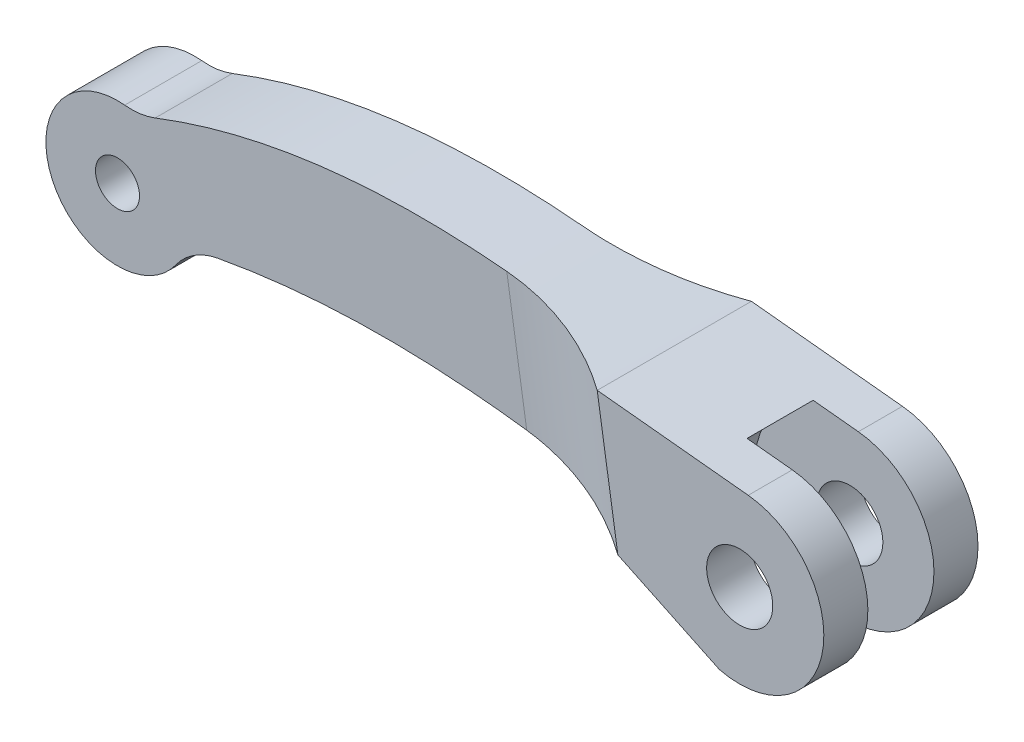
ISO-10303-21;
HEADER;
FILE_DESCRIPTION(('STEP AP214'),'2;1');
FILE_NAME('part.step','',(''),(''),'','','');
FILE_SCHEMA(('AUTOMOTIVE_DESIGN { 1 0 10303 214 1 1 1 1 }'));
ENDSEC;
DATA;
#1=APPLICATION_CONTEXT('core data for automotive mechanical design processes');
#2=APPLICATION_PROTOCOL_DEFINITION('international standard','automotive_design',2000,#1);
#3=PRODUCT_CONTEXT('',#1,'mechanical');
#4=PRODUCT('Part','Part','',(#3));
#5=PRODUCT_RELATED_PRODUCT_CATEGORY('part','',(#4));
#6=PRODUCT_DEFINITION_FORMATION('','',#4);
#7=PRODUCT_DEFINITION_CONTEXT('part definition',#1,'design');
#8=PRODUCT_DEFINITION('design','',#6,#7);
#9=PRODUCT_DEFINITION_SHAPE('','',#8);
#10=(LENGTH_UNIT() NAMED_UNIT(*) SI_UNIT(.MILLI.,.METRE.));
#11=(NAMED_UNIT(*) PLANE_ANGLE_UNIT() SI_UNIT($,.RADIAN.));
#12=(NAMED_UNIT(*) SI_UNIT($,.STERADIAN.) SOLID_ANGLE_UNIT());
#13=UNCERTAINTY_MEASURE_WITH_UNIT(LENGTH_MEASURE(1.E-05),#10,'distance_accuracy_value','');
#14=(GEOMETRIC_REPRESENTATION_CONTEXT(3) GLOBAL_UNCERTAINTY_ASSIGNED_CONTEXT((#13)) GLOBAL_UNIT_ASSIGNED_CONTEXT((#10,
#11,#12)) REPRESENTATION_CONTEXT('',''));
#15=CARTESIAN_POINT('',(0.,0.,0.));
#16=DIRECTION('',(0.,0.,1.));
#17=DIRECTION('',(1.,0.,0.));
#18=AXIS2_PLACEMENT_3D('',#15,#16,#17);
#19=CARTESIAN_POINT('',(30.,0.,3.5));
#20=DIRECTION('',(0.,0.,-1.));
#21=DIRECTION('',(-1.,0.,0.));
#22=AXIS2_PLACEMENT_3D('',#19,#20,#21);
#23=CYLINDRICAL_SURFACE('',#22,3.81951482389573);
#24=CARTESIAN_POINT('',(30.,0.,-1.5));
#25=DIRECTION('',(0.,0.,1.));
#26=DIRECTION('',(1.,0.,0.));
#27=AXIS2_PLACEMENT_3D('',#24,#25,#26);
#28=CIRCLE('',#27,3.81951482389573);
#29=CARTESIAN_POINT('',(29.0736504453051,-3.7054783756589,-1.5));
#30=VERTEX_POINT('',#29);
#31=CARTESIAN_POINT('',(30.3873591535676,3.79982188741875,-1.5));
#32=VERTEX_POINT('',#31);
#33=EDGE_CURVE('E181',#30,#32,#28,.T.);
#34=ORIENTED_EDGE('',*,*,#33,.F.);
#35=DIRECTION('',(0.,0.,-1.));
#36=VECTOR('',#35,1.);
#37=CARTESIAN_POINT('',(29.0736504453051,-3.7054783756589,3.5));
#38=LINE('',#37,#36);
#39=CARTESIAN_POINT('',(29.0736504453051,-3.7054783756589,-3.5));
#40=VERTEX_POINT('',#39);
#41=EDGE_CURVE('E202',#30,#40,#38,.T.);
#42=ORIENTED_EDGE('',*,*,#41,.T.);
#43=CARTESIAN_POINT('',(30.,0.,-3.5));
#44=DIRECTION('',(0.,0.,1.));
#45=DIRECTION('',(1.,0.,0.));
#46=AXIS2_PLACEMENT_3D('',#43,#44,#45);
#47=CIRCLE('',#46,3.81951482389573);
#48=CARTESIAN_POINT('',(30.3873591535676,3.79982188741875,-3.5));
#49=VERTEX_POINT('',#48);
#50=EDGE_CURVE('E187',#40,#49,#47,.T.);
#51=ORIENTED_EDGE('',*,*,#50,.T.);
#52=DIRECTION('',(0.,0.,-1.));
#53=VECTOR('',#52,1.);
#54=CARTESIAN_POINT('',(30.3873591535676,3.79982188741875,3.5));
#55=LINE('',#54,#53);
#56=EDGE_CURVE('E218',#32,#49,#55,.T.);
#57=ORIENTED_EDGE('',*,*,#56,.F.);
#58=EDGE_LOOP('',(#34,#42,#51,#57));
#59=FACE_BOUND('',#58,.T.);
#60=ADVANCED_FACE('F46',(#59),#23,.T.);
#61=CARTESIAN_POINT('',(30.3873591535676,3.79982188741875,3.5));
#62=DIRECTION('',(-0.101415800551142,-0.994844126181871,0.));
#63=DIRECTION('',(0.994844126181871,-0.101415800551142,0.));
#64=AXIS2_PLACEMENT_3D('',#61,#62,#63);
#65=PLANE('',#64);
#66=DIRECTION('',(-0.994844126181871,0.101415800551142,0.));
#67=VECTOR('',#66,1.);
#68=CARTESIAN_POINT('',(30.3873591535676,3.79982188741875,-1.5));
#69=LINE('',#68,#67);
#70=CARTESIAN_POINT('',(28.332958807962,4.00925032974344,-1.5));
#71=VERTEX_POINT('',#70);
#72=EDGE_CURVE('E158',#32,#71,#69,.T.);
#73=ORIENTED_EDGE('',*,*,#72,.F.);
#74=ORIENTED_EDGE('',*,*,#56,.T.);
#75=DIRECTION('',(-0.994844126181871,0.101415800551142,0.));
#76=VECTOR('',#75,1.);
#77=CARTESIAN_POINT('',(30.3873591535676,3.79982188741875,-3.5));
#78=LINE('',#77,#76);
#79=CARTESIAN_POINT('',(23.5309276765666,4.49877609419062,-3.5));
#80=VERTEX_POINT('',#79);
#81=EDGE_CURVE('E205',#49,#80,#78,.T.);
#82=ORIENTED_EDGE('',*,*,#81,.T.);
#83=DIRECTION('',(0.,0.,-1.));
#84=VECTOR('',#83,1.);
#85=CARTESIAN_POINT('',(23.5309276765666,4.49877609419062,1.75));
#86=LINE('',#85,#84);
#87=CARTESIAN_POINT('',(23.5309276765527,4.49877609427949,3.5));
#88=VERTEX_POINT('',#87);
#89=EDGE_CURVE('E355',#80,#88,#86,.F.);
#90=ORIENTED_EDGE('',*,*,#89,.T.);
#91=DIRECTION('',(-0.994844126181871,0.101415800551142,0.));
#92=VECTOR('',#91,1.);
#93=CARTESIAN_POINT('',(30.3873591535676,3.79982188741875,3.5));
#94=LINE('',#93,#92);
#95=CARTESIAN_POINT('',(30.3873591535676,3.79982188741875,3.5));
#96=VERTEX_POINT('',#95);
#97=EDGE_CURVE('E193',#96,#88,#94,.T.);
#98=ORIENTED_EDGE('',*,*,#97,.F.);
#99=CARTESIAN_POINT('',(30.3873591535676,3.79982188741875,1.5));
#100=VERTEX_POINT('',#99);
#101=EDGE_CURVE('E170',#96,#100,#55,.T.);
#102=ORIENTED_EDGE('',*,*,#101,.T.);
#103=DIRECTION('',(-0.994844126181871,0.101415800551142,0.));
#104=VECTOR('',#103,1.);
#105=CARTESIAN_POINT('',(30.3873591535676,3.79982188741875,1.5));
#106=LINE('',#105,#104);
#107=CARTESIAN_POINT('',(28.332958807962,4.00925032974344,1.5));
#108=VERTEX_POINT('',#107);
#109=EDGE_CURVE('E162',#100,#108,#106,.T.);
#110=ORIENTED_EDGE('',*,*,#109,.T.);
#111=DIRECTION('',(0.,0.,1.));
#112=VECTOR('',#111,1.);
#113=CARTESIAN_POINT('',(28.332958807962,4.00925032974344,-1.5));
#114=LINE('',#113,#112);
#115=EDGE_CURVE('E147',#108,#71,#114,.F.);
#116=ORIENTED_EDGE('',*,*,#115,.T.);
#117=EDGE_LOOP('',(#73,#74,#82,#90,#98,#102,#110,#116));
#118=FACE_BOUND('',#117,.T.);
#119=ADVANCED_FACE('F168',(#118),#65,.F.);
#120=CARTESIAN_POINT('',(24.4680384486734,-1.50366690841318,3.5));
#121=DIRECTION('',(0.431316388346312,0.902200738829166,0.));
#122=DIRECTION('',(-0.902200738829166,0.431316388346312,0.));
#123=AXIS2_PLACEMENT_3D('',#120,#121,#122);
#124=PLANE('',#123);
#125=DIRECTION('',(0.902200738829166,-0.431316388346312,0.));
#126=VECTOR('',#125,1.);
#127=CARTESIAN_POINT('',(24.4680384486734,-1.50366690841318,-1.5));
#128=LINE('',#127,#126);
#129=CARTESIAN_POINT('',(26.3997101858718,-2.42714395880917,-1.5));
#130=VERTEX_POINT('',#129);
#131=EDGE_CURVE('E175',#130,#30,#128,.T.);
#132=ORIENTED_EDGE('',*,*,#131,.F.);
#133=DIRECTION('',(0.,0.,1.));
#134=VECTOR('',#133,1.);
#135=CARTESIAN_POINT('',(26.3997101858718,-2.42714395880917,-1.5));
#136=LINE('',#135,#134);
#137=CARTESIAN_POINT('',(26.3997101858718,-2.42714395880917,1.5));
#138=VERTEX_POINT('',#137);
#139=EDGE_CURVE('E321',#130,#138,#136,.T.);
#140=ORIENTED_EDGE('',*,*,#139,.T.);
#141=DIRECTION('',(0.902200738829166,-0.431316388346312,0.));
#142=VECTOR('',#141,1.);
#143=CARTESIAN_POINT('',(24.4680384486734,-1.50366690841318,1.5));
#144=LINE('',#143,#142);
#145=CARTESIAN_POINT('',(29.0736504453051,-3.7054783756589,1.5));
#146=VERTEX_POINT('',#145);
#147=EDGE_CURVE('E165',#138,#146,#144,.T.);
#148=ORIENTED_EDGE('',*,*,#147,.T.);
#149=CARTESIAN_POINT('',(29.0736504453051,-3.7054783756589,3.5));
#150=VERTEX_POINT('',#149);
#151=EDGE_CURVE('E213',#150,#146,#38,.T.);
#152=ORIENTED_EDGE('',*,*,#151,.F.);
#153=DIRECTION('',(0.902200738829166,-0.431316388346312,0.));
#154=VECTOR('',#153,1.);
#155=CARTESIAN_POINT('',(24.4680384486734,-1.50366690841318,3.5));
#156=LINE('',#155,#154);
#157=CARTESIAN_POINT('',(24.4680384486734,-1.50366690841318,3.5));
#158=VERTEX_POINT('',#157);
#159=EDGE_CURVE('E200',#158,#150,#156,.T.);
#160=ORIENTED_EDGE('',*,*,#159,.F.);
#161=DIRECTION('',(0.,0.,-1.));
#162=VECTOR('',#161,1.);
#163=CARTESIAN_POINT('',(24.4680384486734,-1.50366690841318,3.5));
#164=LINE('',#163,#162);
#165=CARTESIAN_POINT('',(24.4680384486734,-1.50366690841318,-3.5));
#166=VERTEX_POINT('',#165);
#167=EDGE_CURVE('E216',#158,#166,#164,.T.);
#168=ORIENTED_EDGE('',*,*,#167,.T.);
#169=DIRECTION('',(0.902200738829166,-0.431316388346312,0.));
#170=VECTOR('',#169,1.);
#171=CARTESIAN_POINT('',(24.4680384486734,-1.50366690841318,-3.5));
#172=LINE('',#171,#170);
#173=EDGE_CURVE('E194',#166,#40,#172,.T.);
#174=ORIENTED_EDGE('',*,*,#173,.T.);
#175=ORIENTED_EDGE('',*,*,#41,.F.);
#176=EDGE_LOOP('',(#132,#140,#148,#152,#160,#168,#174,#175));
#177=FACE_BOUND('',#176,.T.);
#178=ADVANCED_FACE('F298',(#177),#124,.F.);
#179=CARTESIAN_POINT('',(30.,0.,1.75));
#180=DIRECTION('',(0.,0.,-1.));
#181=DIRECTION('',(-1.,0.,0.));
#182=AXIS2_PLACEMENT_3D('',#179,#180,#181);
#183=CYLINDRICAL_SURFACE('',#182,1.5);
#184=CARTESIAN_POINT('',(30.,0.,-3.5));
#185=DIRECTION('',(0.,0.,1.));
#186=DIRECTION('',(1.,0.,0.));
#187=AXIS2_PLACEMENT_3D('',#184,#185,#186);
#188=CIRCLE('',#187,1.5);
#189=CARTESIAN_POINT('',(31.5,0.,-3.5));
#190=VERTEX_POINT('',#189);
#191=EDGE_CURVE('E157',#190,#190,#188,.T.);
#192=ORIENTED_EDGE('',*,*,#191,.F.);
#193=EDGE_LOOP('',(#192));
#194=FACE_BOUND('',#193,.T.);
#195=CARTESIAN_POINT('',(30.,0.,-1.5));
#196=DIRECTION('',(0.,0.,1.));
#197=DIRECTION('',(1.,0.,0.));
#198=AXIS2_PLACEMENT_3D('',#195,#196,#197);
#199=CIRCLE('',#198,1.5);
#200=CARTESIAN_POINT('',(31.5,0.,-1.5));
#201=VERTEX_POINT('',#200);
#202=EDGE_CURVE('E171',#201,#201,#199,.T.);
#203=ORIENTED_EDGE('',*,*,#202,.T.);
#204=EDGE_LOOP('',(#203));
#205=FACE_BOUND('',#204,.T.);
#206=ADVANCED_FACE('F311',(#194,#205),#183,.F.);
#207=CARTESIAN_POINT('',(15.1434566288946,-0.0860465630170061,1.75));
#208=DIRECTION('',(0.,0.,1.));
#209=DIRECTION('',(1.,0.,0.));
#210=AXIS2_PLACEMENT_3D('',#207,#208,#209);
#211=PLANE('',#210);
#212=CARTESIAN_POINT('',(0.,0.,1.75));
#213=DIRECTION('',(0.,0.,1.));
#214=DIRECTION('',(1.,0.,0.));
#215=AXIS2_PLACEMENT_3D('',#212,#213,#214);
#216=CIRCLE('',#215,0.999999999999999);
#217=CARTESIAN_POINT('',(0.999999999999999,0.,1.75));
#218=VERTEX_POINT('',#217);
#219=EDGE_CURVE('E221',#218,#218,#216,.T.);
#220=ORIENTED_EDGE('',*,*,#219,.F.);
#221=EDGE_LOOP('',(#220));
#222=FACE_BOUND('',#221,.T.);
#223=CARTESIAN_POINT('',(0.,0.,1.75));
#224=DIRECTION('',(0.,0.,1.));
#225=DIRECTION('',(1.,0.,0.));
#226=AXIS2_PLACEMENT_3D('',#223,#224,#225);
#227=CIRCLE('',#226,3.25156797592651);
#228=CARTESIAN_POINT('',(0.326131913208965,3.23517113569861,1.75));
#229=VERTEX_POINT('',#228);
#230=CARTESIAN_POINT('',(2.64989931473271,-1.88433752917303,1.75));
#231=VERTEX_POINT('',#230);
#232=EDGE_CURVE('E358',#229,#231,#227,.T.);
#233=ORIENTED_EDGE('',*,*,#232,.T.);
#234=CARTESIAN_POINT('',(5.09478067752598,-3.62288724714664,1.75));
#235=DIRECTION('',(0.,0.,1.));
#236=DIRECTION('',(1.,0.,0.));
#237=AXIS2_PLACEMENT_3D('',#234,#235,#236);
#238=CIRCLE('',#237,3.);
#239=CARTESIAN_POINT('',(4.54837920771633,-0.673065992597505,1.75));
#240=VERTEX_POINT('',#239);
#241=EDGE_CURVE('E13',#231,#240,#238,.F.);
#242=ORIENTED_EDGE('',*,*,#241,.T.);
#243=CARTESIAN_POINT('',(3.10378888476465,-0.969117568142393,1.75));
#244=CARTESIAN_POINT('',(14.5104815776484,1.59646624385346,1.75));
#245=CARTESIAN_POINT('',(28.4490744755167,-2.56800117163254,1.75));
#246=B_SPLINE_CURVE_WITH_KNOTS('',2,(#243,#244,#245),.UNSPECIFIED.,.F.,.F.,(3,3),(0.,1.),.UNSPECIFIED.);
#247=CARTESIAN_POINT('',(18.5791240102049,-0.420349304380086,1.75));
#248=VERTEX_POINT('',#247);
#249=EDGE_CURVE('E227',#240,#248,#246,.T.);
#250=ORIENTED_EDGE('',*,*,#249,.T.);
#251=DIRECTION('',(-0.154253001765196,0.988031381812555,0.));
#252=VECTOR('',#251,1.);
#253=CARTESIAN_POINT('',(17.9472389772635,3.62704189773231,1.75));
#254=LINE('',#253,#252);
#255=CARTESIAN_POINT('',(17.6743606185291,5.37490015225305,1.75));
#256=VERTEX_POINT('',#255);
#257=EDGE_CURVE('E346',#248,#256,#254,.T.);
#258=ORIENTED_EDGE('',*,*,#257,.T.);
#259=CARTESIAN_POINT('',(29.5303772913072,2.96301442984674,1.75));
#260=CARTESIAN_POINT('',(12.7162438185557,8.072477664399,1.75));
#261=CARTESIAN_POINT('',(0.942854613223681,3.11186752295043,1.75));
#262=B_SPLINE_CURVE_WITH_KNOTS('',2,(#259,#260,#261),.UNSPECIFIED.,.F.,.F.,(3,3),(0.,1.),.UNSPECIFIED.);
#263=CARTESIAN_POINT('',(1.71263861783045,3.42335603326119,1.75));
#264=VERTEX_POINT('',#263);
#265=EDGE_CURVE('E232',#256,#264,#262,.T.);
#266=ORIENTED_EDGE('',*,*,#265,.T.);
#267=CARTESIAN_POINT('',(0.62703158588092,6.22004288955772,1.75));
#268=DIRECTION('',(0.,0.,1.));
#269=DIRECTION('',(1.,0.,0.));
#270=AXIS2_PLACEMENT_3D('',#267,#268,#269);
#271=CIRCLE('',#270,3.);
#272=EDGE_CURVE('E377',#264,#229,#271,.F.);
#273=ORIENTED_EDGE('',*,*,#272,.T.);
#274=EDGE_LOOP('',(#233,#242,#250,#258,#266,#273));
#275=FACE_BOUND('',#274,.T.);
#276=ADVANCED_FACE('F376',(#222,#275),#211,.T.);
#277=CARTESIAN_POINT('',(15.1434566288946,-0.0860465630170061,-1.75));
#278=DIRECTION('',(0.,0.,1.));
#279=DIRECTION('',(1.,0.,0.));
#280=AXIS2_PLACEMENT_3D('',#277,#278,#279);
#281=PLANE('',#280);
#282=CARTESIAN_POINT('',(0.,0.,-1.75));
#283=DIRECTION('',(0.,0.,1.));
#284=DIRECTION('',(1.,0.,0.));
#285=AXIS2_PLACEMENT_3D('',#282,#283,#284);
#286=CIRCLE('',#285,0.999999999999999);
#287=CARTESIAN_POINT('',(0.999999999999999,0.,-1.75));
#288=VERTEX_POINT('',#287);
#289=EDGE_CURVE('E220',#288,#288,#286,.T.);
#290=ORIENTED_EDGE('',*,*,#289,.T.);
#291=EDGE_LOOP('',(#290));
#292=FACE_BOUND('',#291,.T.);
#293=CARTESIAN_POINT('',(29.5303772913072,2.96301442984674,-1.75));
#294=CARTESIAN_POINT('',(12.7162438185557,8.072477664399,-1.75));
#295=CARTESIAN_POINT('',(0.942854613223681,3.11186752295043,-1.75));
#296=B_SPLINE_CURVE_WITH_KNOTS('',2,(#293,#294,#295),.UNSPECIFIED.,.F.,.F.,(3,3),(0.,1.),.UNSPECIFIED.);
#297=CARTESIAN_POINT('',(17.6743606185291,5.37490015225304,-1.75));
#298=VERTEX_POINT('',#297);
#299=CARTESIAN_POINT('',(1.71263861783045,3.42335603326119,-1.75));
#300=VERTEX_POINT('',#299);
#301=EDGE_CURVE('E361',#298,#300,#296,.T.);
#302=ORIENTED_EDGE('',*,*,#301,.F.);
#303=DIRECTION('',(0.154253001765196,-0.988031381812555,0.));
#304=VECTOR('',#303,1.);
#305=CARTESIAN_POINT('',(18.4464257666506,0.429618135104225,-1.75));
#306=LINE('',#305,#304);
#307=CARTESIAN_POINT('',(18.5791240102049,-0.420349304380086,-1.75));
#308=VERTEX_POINT('',#307);
#309=EDGE_CURVE('E342',#298,#308,#306,.T.);
#310=ORIENTED_EDGE('',*,*,#309,.T.);
#311=CARTESIAN_POINT('',(3.10378888476465,-0.969117568142393,-1.75));
#312=CARTESIAN_POINT('',(14.5104815776484,1.59646624385346,-1.75));
#313=CARTESIAN_POINT('',(28.4490744755167,-2.56800117163254,-1.75));
#314=B_SPLINE_CURVE_WITH_KNOTS('',2,(#311,#312,#313),.UNSPECIFIED.,.F.,.F.,(3,3),(0.,1.),.UNSPECIFIED.);
#315=CARTESIAN_POINT('',(4.54837920771633,-0.673065992597505,-1.75));
#316=VERTEX_POINT('',#315);
#317=EDGE_CURVE('E224',#316,#308,#314,.T.);
#318=ORIENTED_EDGE('',*,*,#317,.F.);
#319=CARTESIAN_POINT('',(5.09478067752598,-3.62288724714664,-1.75));
#320=DIRECTION('',(0.,0.,1.));
#321=DIRECTION('',(1.,0.,0.));
#322=AXIS2_PLACEMENT_3D('',#319,#320,#321);
#323=CIRCLE('',#322,3.);
#324=CARTESIAN_POINT('',(2.64989931473271,-1.88433752917303,-1.75));
#325=VERTEX_POINT('',#324);
#326=EDGE_CURVE('E54',#316,#325,#323,.T.);
#327=ORIENTED_EDGE('',*,*,#326,.T.);
#328=CARTESIAN_POINT('',(0.,0.,-1.75));
#329=DIRECTION('',(0.,0.,1.));
#330=DIRECTION('',(1.,0.,0.));
#331=AXIS2_PLACEMENT_3D('',#328,#329,#330);
#332=CIRCLE('',#331,3.25156797592651);
#333=CARTESIAN_POINT('',(0.326131913208965,3.23517113569861,-1.75));
#334=VERTEX_POINT('',#333);
#335=EDGE_CURVE('E233',#334,#325,#332,.T.);
#336=ORIENTED_EDGE('',*,*,#335,.F.);
#337=CARTESIAN_POINT('',(0.62703158588092,6.22004288955772,-1.75));
#338=DIRECTION('',(0.,0.,1.));
#339=DIRECTION('',(1.,0.,0.));
#340=AXIS2_PLACEMENT_3D('',#337,#338,#339);
#341=CIRCLE('',#340,3.);
#342=EDGE_CURVE('E385',#334,#300,#341,.T.);
#343=ORIENTED_EDGE('',*,*,#342,.T.);
#344=EDGE_LOOP('',(#302,#310,#318,#327,#336,#343));
#345=FACE_BOUND('',#344,.T.);
#346=ADVANCED_FACE('F248',(#292,#345),#281,.F.);
#347=DIRECTION('',(0.,0.,-1.));
#348=VECTOR('',#347,1.);
#349=SURFACE_OF_LINEAR_EXTRUSION('',#246,#348);
#350=ORIENTED_EDGE('',*,*,#249,.F.);
#351=DIRECTION('',(0.,0.,-1.));
#352=VECTOR('',#351,1.);
#353=CARTESIAN_POINT('',(4.54837920771632,-0.673065992597507,1.75));
#354=LINE('',#353,#352);
#355=EDGE_CURVE('E387',#240,#316,#354,.T.);
#356=ORIENTED_EDGE('',*,*,#355,.T.);
#357=ORIENTED_EDGE('',*,*,#317,.T.);
#358=CARTESIAN_POINT('',(18.5791240102049,-0.420349304379723,-1.75));
#359=CARTESIAN_POINT('',(18.7860140453835,-0.447370595897928,-1.74999530920506));
#360=CARTESIAN_POINT('',(18.9927379085319,-0.475593994673789,-1.75601447878378));
#361=CARTESIAN_POINT('',(19.4051563336976,-0.534270048917931,-1.77994078720679));
#362=CARTESIAN_POINT('',(19.610851008855,-0.564722453328576,-1.79784658906202));
#363=CARTESIAN_POINT('',(20.0205614731591,-0.627687798182205,-1.84538654306364));
#364=CARTESIAN_POINT('',(20.2245772579139,-0.660200744013517,-1.87502072588088));
#365=CARTESIAN_POINT('',(20.6255723778886,-0.726307727488005,-1.94500637910223));
#366=CARTESIAN_POINT('',(20.8226051074626,-0.75985913951839,-1.98509305031042));
#367=CARTESIAN_POINT('',(21.2138725581274,-0.828529724936224,-2.07609060566597));
#368=CARTESIAN_POINT('',(21.4081074666767,-0.863648792635825,-2.1270007609863));
#369=CARTESIAN_POINT('',(21.7931544552154,-0.935217907124064,-2.23941655972284));
#370=CARTESIAN_POINT('',(21.9839672178874,-0.971667683945057,-2.30092006332329));
#371=CARTESIAN_POINT('',(22.573170325231,-1.08711660566086,-2.50905044827282));
#372=CARTESIAN_POINT('',(22.9649715204033,-1.16809814444615,-2.67393241950613));
#373=CARTESIAN_POINT('',(23.5387118233923,-1.29211655645065,-2.95620482581614));
#374=CARTESIAN_POINT('',(23.7291813618012,-1.33424783017205,-3.05712704520281));
#375=CARTESIAN_POINT('',(24.103610344856,-1.41881081314197,-3.27020103375741));
#376=CARTESIAN_POINT('',(24.2875710840257,-1.46124246061201,-3.38235055276158));
#377=CARTESIAN_POINT('',(24.4680384486823,-1.50366690834397,-3.50000000001331));
#378=B_SPLINE_CURVE_WITH_KNOTS('',3,(#358,#359,#360,#361,#362,#363,#364,#365,#366,#367,#368,
#369,#370,#371,#372,#373,#374,#375,#376,#377),.UNSPECIFIED.,.F.,.F.,(4,2,2,2,2,2,2,2,2,4),(0.,
0.625837677195284,1.25160497311129,1.87737390548016,2.4886142444593,3.09981343703296,
3.71088931419059,5.0055924490434,5.66418184373582,6.32263950787212),.UNSPECIFIED.);
#379=EDGE_CURVE('E257',#308,#166,#378,.T.);
#380=ORIENTED_EDGE('',*,*,#379,.T.);
#381=ORIENTED_EDGE('',*,*,#167,.F.);
#382=CARTESIAN_POINT('',(24.4680384486734,-1.50366690841318,3.5));
#383=CARTESIAN_POINT('',(24.2087907484848,-1.44271183129056,3.33096907374079));
#384=CARTESIAN_POINT('',(23.9421942911938,-1.38172878816104,3.17325175496518));
#385=CARTESIAN_POINT('',(23.3961693014222,-1.2606979676759,2.88126971936627));
#386=CARTESIAN_POINT('',(23.1167379123716,-1.20065040254368,2.74701025562743));
#387=CARTESIAN_POINT('',(22.5537447198748,-1.08390311585086,2.50572509491843));
#388=CARTESIAN_POINT('',(22.2704357794165,-1.02715783660932,2.39813175619154));
#389=CARTESIAN_POINT('',(21.6954547493137,-0.916411107125712,2.20694047877803));
#390=CARTESIAN_POINT('',(21.4037851260966,-0.862408860450218,2.12333554195791));
#391=CARTESIAN_POINT('',(20.6997525697086,-0.737712724116284,1.95323357867711));
#392=CARTESIAN_POINT('',(20.2842682547758,-0.668624043510336,1.87808209796108));
#393=CARTESIAN_POINT('',(19.6523659448639,-0.570928876644029,1.80177380294828));
#394=CARTESIAN_POINT('',(19.4384725106214,-0.539114798854045,1.78240312462466));
#395=CARTESIAN_POINT('',(19.0095069111954,-0.477886357584167,1.75651619776064));
#396=CARTESIAN_POINT('',(18.7944344314403,-0.448472671478514,1.75000356573118));
#397=CARTESIAN_POINT('',(18.5791240102049,-0.420349304380084,1.75));
#398=B_SPLINE_CURVE_WITH_KNOTS('',3,(#382,#383,#384,#385,#386,#387,#388,#389,#390,#391,#392,
#393,#394,#395,#396,#397),.UNSPECIFIED.,.F.,.F.,(4,2,2,2,2,2,2,4),(0.,0.94597937533463,
1.8921703198056,2.81604464947242,3.73964918272226,5.01984132922365,5.67084241890695,
6.32202658596446),.UNSPECIFIED.);
#399=EDGE_CURVE('E265',#158,#248,#398,.T.);
#400=ORIENTED_EDGE('',*,*,#399,.T.);
#401=EDGE_LOOP('',(#350,#356,#357,#380,#381,#400));
#402=FACE_BOUND('',#401,.T.);
#403=ADVANCED_FACE('F242',(#402),#349,.F.);
#404=DIRECTION('',(0.,0.,-1.));
#405=VECTOR('',#404,1.);
#406=SURFACE_OF_LINEAR_EXTRUSION('',#262,#405);
#407=ORIENTED_EDGE('',*,*,#301,.T.);
#408=DIRECTION('',(0.,0.,-1.));
#409=VECTOR('',#408,1.);
#410=CARTESIAN_POINT('',(1.71263861783045,3.42335603326119,-1.75));
#411=LINE('',#410,#409);
#412=EDGE_CURVE('E382',#300,#264,#411,.F.);
#413=ORIENTED_EDGE('',*,*,#412,.T.);
#414=ORIENTED_EDGE('',*,*,#265,.F.);
#415=CARTESIAN_POINT('',(17.6743606183166,5.37490014990071,1.75));
#416=CARTESIAN_POINT('',(17.8774924874047,5.35655896263313,1.74999481176071));
#417=CARTESIAN_POINT('',(18.0804945853478,5.33688395836435,1.75587268286286));
#418=CARTESIAN_POINT('',(18.4855384607256,5.29503597788547,1.77923762788022));
#419=CARTESIAN_POINT('',(18.6875803909922,5.27286341411211,1.79672278734219));
#420=CARTESIAN_POINT('',(19.0900671735783,5.22618421375906,1.8431451007266));
#421=CARTESIAN_POINT('',(19.2905120529013,5.2016776167352,1.87208206059688));
#422=CARTESIAN_POINT('',(19.6844923712389,5.15112980122402,1.94040812176596));
#423=CARTESIAN_POINT('',(19.8780795956272,5.12513806292835,1.97953613269718));
#424=CARTESIAN_POINT('',(20.2625574955273,5.07132100053063,2.06834679747995));
#425=CARTESIAN_POINT('',(20.453448309191,5.04349577078519,2.11802890848004));
#426=CARTESIAN_POINT('',(20.831918300778,4.9862445988178,2.22771585916324));
#427=CARTESIAN_POINT('',(21.0194980813148,4.95681895193739,2.28771879862701));
#428=CARTESIAN_POINT('',(21.6111994449127,4.86085264847172,2.49508084777362));
#429=CARTESIAN_POINT('',(22.0084212849811,4.79166489326487,2.66167592030205));
#430=CARTESIAN_POINT('',(22.5898032367781,4.6843475520423,2.94764474697273));
#431=CARTESIAN_POINT('',(22.7828248733416,4.64764599629588,3.05004839848885));
#432=CARTESIAN_POINT('',(23.1620848263203,4.5736041952871,3.26641956778257));
#433=CARTESIAN_POINT('',(23.3483247377753,4.53626410328256,3.38038434223539));
#434=CARTESIAN_POINT('',(23.5309276765666,4.49877609419062,3.5));
#435=B_SPLINE_CURVE_WITH_KNOTS('',3,(#415,#416,#417,#418,#419,#420,#421,#422,#423,#424,#425,
#426,#427,#428,#429,#430,#431,#432,#433,#434),.UNSPECIFIED.,.F.,.F.,(4,2,2,2,2,2,2,2,2,4),(0.,
0.611771774376838,1.22344267096696,1.83510320316278,2.43241640383845,3.02969888907043,
3.62687152311871,4.93194914505523,5.59631369583589,6.26052096748151),.UNSPECIFIED.);
#436=EDGE_CURVE('E273',#256,#88,#435,.T.);
#437=ORIENTED_EDGE('',*,*,#436,.T.);
#438=ORIENTED_EDGE('',*,*,#89,.F.);
#439=CARTESIAN_POINT('',(23.5309276765666,4.49877609419062,-3.5));
#440=CARTESIAN_POINT('',(23.2762492088152,4.55107079794053,-3.33314487661136));
#441=CARTESIAN_POINT('',(23.0143499985677,4.60308975224954,-3.17724504800839));
#442=CARTESIAN_POINT('',(22.4779023217435,4.7055956451046,-2.88821115012338));
#443=CARTESIAN_POINT('',(22.2033506905029,4.75608219506563,-2.75508281618441));
#444=CARTESIAN_POINT('',(21.6502148600744,4.85333838739625,-2.51543234248308));
#445=CARTESIAN_POINT('',(21.3718841427666,4.90016804645504,-2.40835003235494));
#446=CARTESIAN_POINT('',(20.8069402736641,4.99053153499357,-2.21757528222022));
#447=CARTESIAN_POINT('',(20.5203295415776,5.03406631415555,-2.13387608364334));
#448=CARTESIAN_POINT('',(19.8175133979535,5.13466909724089,-1.96016027765403));
#449=CARTESIAN_POINT('',(19.3978450730145,5.18965702980109,-1.88248910343039));
#450=CARTESIAN_POINT('',(18.7593407131524,5.26484898757778,-1.80357578088024));
#451=CARTESIAN_POINT('',(18.5430957075436,5.28887303498112,-1.78353200742619));
#452=CARTESIAN_POINT('',(18.1094250436789,5.33407241068699,-1.75674391438439));
#453=CARTESIAN_POINT('',(17.8919990616831,5.3552469120969,-1.75000344748212));
#454=CARTESIAN_POINT('',(17.6743606186518,5.37490015224196,-1.75));
#455=B_SPLINE_CURVE_WITH_KNOTS('',3,(#439,#440,#441,#442,#443,#444,#445,#446,#447,#448,#449,
#450,#451,#452,#453,#454),.UNSPECIFIED.,.F.,.F.,(4,2,2,2,2,2,2,4),(0.,0.926490960433625,
1.85321492902886,2.75777524300262,3.66207383498635,4.94947191806315,5.60460144439039,
6.25992067076317),.UNSPECIFIED.);
#456=EDGE_CURVE('E340',#80,#298,#455,.T.);
#457=ORIENTED_EDGE('',*,*,#456,.T.);
#458=EDGE_LOOP('',(#407,#413,#414,#437,#438,#457));
#459=FACE_BOUND('',#458,.T.);
#460=ADVANCED_FACE('F247',(#459),#406,.F.);
#461=CARTESIAN_POINT('',(0.,0.,1.75));
#462=DIRECTION('',(0.,0.,-1.));
#463=DIRECTION('',(-1.,0.,0.));
#464=AXIS2_PLACEMENT_3D('',#461,#462,#463);
#465=CYLINDRICAL_SURFACE('',#464,3.25156797592651);
#466=ORIENTED_EDGE('',*,*,#232,.F.);
#467=DIRECTION('',(0.,0.,-1.));
#468=VECTOR('',#467,1.);
#469=CARTESIAN_POINT('',(0.326131913208966,3.23517113569861,1.75));
#470=LINE('',#469,#468);
#471=EDGE_CURVE('E384',#229,#334,#470,.T.);
#472=ORIENTED_EDGE('',*,*,#471,.T.);
#473=ORIENTED_EDGE('',*,*,#335,.T.);
#474=DIRECTION('',(0.,0.,-1.));
#475=VECTOR('',#474,1.);
#476=CARTESIAN_POINT('',(2.64989931473271,-1.88433752917303,1.75));
#477=LINE('',#476,#475);
#478=EDGE_CURVE('E272',#325,#231,#477,.F.);
#479=ORIENTED_EDGE('',*,*,#478,.T.);
#480=EDGE_LOOP('',(#466,#472,#473,#479));
#481=FACE_BOUND('',#480,.T.);
#482=ADVANCED_FACE('F393',(#481),#465,.T.);
#483=CARTESIAN_POINT('',(0.,0.,1.75));
#484=DIRECTION('',(0.,0.,-1.));
#485=DIRECTION('',(-1.,0.,0.));
#486=AXIS2_PLACEMENT_3D('',#483,#484,#485);
#487=CYLINDRICAL_SURFACE('',#486,0.999999999999999);
#488=ORIENTED_EDGE('',*,*,#219,.T.);
#489=EDGE_LOOP('',(#488));
#490=FACE_BOUND('',#489,.T.);
#491=ORIENTED_EDGE('',*,*,#289,.F.);
#492=EDGE_LOOP('',(#491));
#493=FACE_BOUND('',#492,.T.);
#494=ADVANCED_FACE('F400',(#490,#493),#487,.F.);
#495=CARTESIAN_POINT('',(30.,0.,3.5));
#496=DIRECTION('',(0.,0.,1.));
#497=DIRECTION('',(1.,0.,0.));
#498=AXIS2_PLACEMENT_3D('',#495,#496,#497);
#499=PLANE('',#498);
#500=CARTESIAN_POINT('',(30.,0.,3.5));
#501=DIRECTION('',(0.,0.,1.));
#502=DIRECTION('',(1.,0.,0.));
#503=AXIS2_PLACEMENT_3D('',#500,#501,#502);
#504=CIRCLE('',#503,3.81951482389573);
#505=EDGE_CURVE('E190',#150,#96,#504,.T.);
#506=ORIENTED_EDGE('',*,*,#505,.T.);
#507=ORIENTED_EDGE('',*,*,#97,.T.);
#508=DIRECTION('',(0.154253001765195,-0.988031381812555,0.));
#509=VECTOR('',#508,1.);
#510=CARTESIAN_POINT('',(23.5309276765527,4.49877609427949,3.5));
#511=LINE('',#510,#509);
#512=EDGE_CURVE('E197',#88,#158,#511,.T.);
#513=ORIENTED_EDGE('',*,*,#512,.T.);
#514=ORIENTED_EDGE('',*,*,#159,.T.);
#515=EDGE_LOOP('',(#506,#507,#513,#514));
#516=FACE_BOUND('',#515,.T.);
#517=CARTESIAN_POINT('',(30.,0.,3.5));
#518=DIRECTION('',(0.,0.,1.));
#519=DIRECTION('',(1.,0.,0.));
#520=AXIS2_PLACEMENT_3D('',#517,#518,#519);
#521=CIRCLE('',#520,1.5);
#522=CARTESIAN_POINT('',(31.5,0.,3.5));
#523=VERTEX_POINT('',#522);
#524=EDGE_CURVE('E184',#523,#523,#521,.T.);
#525=ORIENTED_EDGE('',*,*,#524,.F.);
#526=EDGE_LOOP('',(#525));
#527=FACE_BOUND('',#526,.T.);
#528=ADVANCED_FACE('F312',(#516,#527),#499,.T.);
#529=CARTESIAN_POINT('',(30.,0.,-3.5));
#530=DIRECTION('',(0.,0.,1.));
#531=DIRECTION('',(1.,0.,0.));
#532=AXIS2_PLACEMENT_3D('',#529,#530,#531);
#533=PLANE('',#532);
#534=ORIENTED_EDGE('',*,*,#50,.F.);
#535=ORIENTED_EDGE('',*,*,#173,.F.);
#536=DIRECTION('',(0.154253001765195,-0.988031381812555,0.));
#537=VECTOR('',#536,1.);
#538=CARTESIAN_POINT('',(23.5309276765527,4.49877609427949,-3.5));
#539=LINE('',#538,#537);
#540=EDGE_CURVE('E208',#80,#166,#539,.T.);
#541=ORIENTED_EDGE('',*,*,#540,.F.);
#542=ORIENTED_EDGE('',*,*,#81,.F.);
#543=EDGE_LOOP('',(#534,#535,#541,#542));
#544=FACE_BOUND('',#543,.T.);
#545=ORIENTED_EDGE('',*,*,#191,.T.);
#546=EDGE_LOOP('',(#545));
#547=FACE_BOUND('',#546,.T.);
#548=ADVANCED_FACE('F304',(#544,#547),#533,.F.);
#549=ORIENTED_EDGE('',*,*,#151,.T.);
#550=CARTESIAN_POINT('',(30.,0.,1.5));
#551=DIRECTION('',(0.,0.,1.));
#552=DIRECTION('',(1.,0.,0.));
#553=AXIS2_PLACEMENT_3D('',#550,#551,#552);
#554=CIRCLE('',#553,3.81951482389573);
#555=EDGE_CURVE('E172',#146,#100,#554,.T.);
#556=ORIENTED_EDGE('',*,*,#555,.T.);
#557=ORIENTED_EDGE('',*,*,#101,.F.);
#558=ORIENTED_EDGE('',*,*,#505,.F.);
#559=EDGE_LOOP('',(#549,#556,#557,#558));
#560=FACE_BOUND('',#559,.T.);
#561=ADVANCED_FACE('F294',(#560),#23,.T.);
#562=CARTESIAN_POINT('',(30.,0.,1.5));
#563=DIRECTION('',(0.,0.,1.));
#564=DIRECTION('',(1.,0.,0.));
#565=AXIS2_PLACEMENT_3D('',#562,#563,#564);
#566=CIRCLE('',#565,1.5);
#567=CARTESIAN_POINT('',(31.5,0.,1.5));
#568=VERTEX_POINT('',#567);
#569=EDGE_CURVE('E322',#568,#568,#566,.T.);
#570=ORIENTED_EDGE('',*,*,#569,.F.);
#571=EDGE_LOOP('',(#570));
#572=FACE_BOUND('',#571,.T.);
#573=ORIENTED_EDGE('',*,*,#524,.T.);
#574=EDGE_LOOP('',(#573));
#575=FACE_BOUND('',#574,.T.);
#576=ADVANCED_FACE('F303',(#572,#575),#183,.F.);
#577=CARTESIAN_POINT('',(30.,0.,-1.5));
#578=DIRECTION('',(0.,0.,1.));
#579=DIRECTION('',(1.,0.,0.));
#580=AXIS2_PLACEMENT_3D('',#577,#578,#579);
#581=CYLINDRICAL_SURFACE('',#580,4.34201733558255);
#582=CARTESIAN_POINT('',(30.,0.,1.5));
#583=DIRECTION('',(0.,0.,1.));
#584=DIRECTION('',(1.,0.,0.));
#585=AXIS2_PLACEMENT_3D('',#582,#583,#584);
#586=CIRCLE('',#585,4.34201733558255);
#587=EDGE_CURVE('E150',#108,#138,#586,.T.);
#588=ORIENTED_EDGE('',*,*,#587,.T.);
#589=ORIENTED_EDGE('',*,*,#139,.F.);
#590=CARTESIAN_POINT('',(30.,0.,-1.5));
#591=DIRECTION('',(0.,0.,1.));
#592=DIRECTION('',(1.,0.,0.));
#593=AXIS2_PLACEMENT_3D('',#590,#591,#592);
#594=CIRCLE('',#593,4.34201733558255);
#595=EDGE_CURVE('E153',#71,#130,#594,.T.);
#596=ORIENTED_EDGE('',*,*,#595,.F.);
#597=ORIENTED_EDGE('',*,*,#115,.F.);
#598=EDGE_LOOP('',(#588,#589,#596,#597));
#599=FACE_BOUND('',#598,.T.);
#600=ADVANCED_FACE('F149',(#599),#581,.F.);
#601=CARTESIAN_POINT('',(30.,0.,-1.5));
#602=DIRECTION('',(0.,0.,1.));
#603=DIRECTION('',(1.,0.,0.));
#604=AXIS2_PLACEMENT_3D('',#601,#602,#603);
#605=PLANE('',#604);
#606=ORIENTED_EDGE('',*,*,#202,.F.);
#607=EDGE_LOOP('',(#606));
#608=FACE_BOUND('',#607,.T.);
#609=ORIENTED_EDGE('',*,*,#72,.T.);
#610=ORIENTED_EDGE('',*,*,#595,.T.);
#611=ORIENTED_EDGE('',*,*,#131,.T.);
#612=ORIENTED_EDGE('',*,*,#33,.T.);
#613=EDGE_LOOP('',(#609,#610,#611,#612));
#614=FACE_BOUND('',#613,.T.);
#615=ADVANCED_FACE('F327',(#608,#614),#605,.T.);
#616=CARTESIAN_POINT('',(30.,0.,1.5));
#617=DIRECTION('',(0.,0.,1.));
#618=DIRECTION('',(1.,0.,0.));
#619=AXIS2_PLACEMENT_3D('',#616,#617,#618);
#620=PLANE('',#619);
#621=ORIENTED_EDGE('',*,*,#569,.T.);
#622=EDGE_LOOP('',(#621));
#623=FACE_BOUND('',#622,.T.);
#624=ORIENTED_EDGE('',*,*,#555,.F.);
#625=ORIENTED_EDGE('',*,*,#147,.F.);
#626=ORIENTED_EDGE('',*,*,#587,.F.);
#627=ORIENTED_EDGE('',*,*,#109,.F.);
#628=EDGE_LOOP('',(#624,#625,#626,#627));
#629=FACE_BOUND('',#628,.T.);
#630=ADVANCED_FACE('F161',(#623,#629),#620,.F.);
#631=CARTESIAN_POINT('',(17.9472389772635,3.62704189773231,-11.75));
#632=DIRECTION('',(0.154253001765196,-0.988031381812555,0.));
#633=DIRECTION('',(0.988031381812555,0.154253001765196,0.));
#634=AXIS2_PLACEMENT_3D('',#631,#632,#633);
#635=CYLINDRICAL_SURFACE('',#634,10.);
#636=ORIENTED_EDGE('',*,*,#379,.F.);
#637=ORIENTED_EDGE('',*,*,#309,.F.);
#638=ORIENTED_EDGE('',*,*,#456,.F.);
#639=ORIENTED_EDGE('',*,*,#540,.T.);
#640=EDGE_LOOP('',(#636,#637,#638,#639));
#641=FACE_BOUND('',#640,.T.);
#642=ADVANCED_FACE('F252',(#641),#635,.F.);
#643=CARTESIAN_POINT('',(17.9472389772635,3.62704189773231,11.75));
#644=DIRECTION('',(0.154253001765196,-0.988031381812555,0.));
#645=DIRECTION('',(0.988031381812555,0.154253001765196,0.));
#646=AXIS2_PLACEMENT_3D('',#643,#644,#645);
#647=CYLINDRICAL_SURFACE('',#646,10.);
#648=ORIENTED_EDGE('',*,*,#399,.F.);
#649=ORIENTED_EDGE('',*,*,#512,.F.);
#650=ORIENTED_EDGE('',*,*,#436,.F.);
#651=ORIENTED_EDGE('',*,*,#257,.F.);
#652=EDGE_LOOP('',(#648,#649,#650,#651));
#653=FACE_BOUND('',#652,.T.);
#654=ADVANCED_FACE('F279',(#653),#647,.F.);
#655=CARTESIAN_POINT('',(0.62703158588092,6.22004288955772,0.));
#656=DIRECTION('',(0.,0.,-1.));
#657=DIRECTION('',(-1.,0.,0.));
#658=AXIS2_PLACEMENT_3D('',#655,#656,#657);
#659=CYLINDRICAL_SURFACE('',#658,3.);
#660=ORIENTED_EDGE('',*,*,#272,.F.);
#661=ORIENTED_EDGE('',*,*,#412,.F.);
#662=ORIENTED_EDGE('',*,*,#342,.F.);
#663=ORIENTED_EDGE('',*,*,#471,.F.);
#664=EDGE_LOOP('',(#660,#661,#662,#663));
#665=FACE_BOUND('',#664,.T.);
#666=ADVANCED_FACE('F282',(#665),#659,.F.);
#667=CARTESIAN_POINT('',(5.09478067752598,-3.62288724714664,0.));
#668=DIRECTION('',(0.,0.,-1.));
#669=DIRECTION('',(-1.,0.,0.));
#670=AXIS2_PLACEMENT_3D('',#667,#668,#669);
#671=CYLINDRICAL_SURFACE('',#670,3.);
#672=ORIENTED_EDGE('',*,*,#241,.F.);
#673=ORIENTED_EDGE('',*,*,#478,.F.);
#674=ORIENTED_EDGE('',*,*,#326,.F.);
#675=ORIENTED_EDGE('',*,*,#355,.F.);
#676=EDGE_LOOP('',(#672,#673,#674,#675));
#677=FACE_BOUND('',#676,.T.);
#678=ADVANCED_FACE('F48',(#677),#671,.F.);
#679=CLOSED_SHELL('',(#60,#119,#178,#206,#276,#346,#403,#460,#482,#494,#528,#548,#561,#576,#600,
#615,#630,#642,#654,#666,#678));
#680=MANIFOLD_SOLID_BREP('B2',#679);
#681=ADVANCED_BREP_SHAPE_REPRESENTATION('',(#18,#680),#14);
#682=SHAPE_DEFINITION_REPRESENTATION(#9,#681);
ENDSEC;
END-ISO-10303-21;
